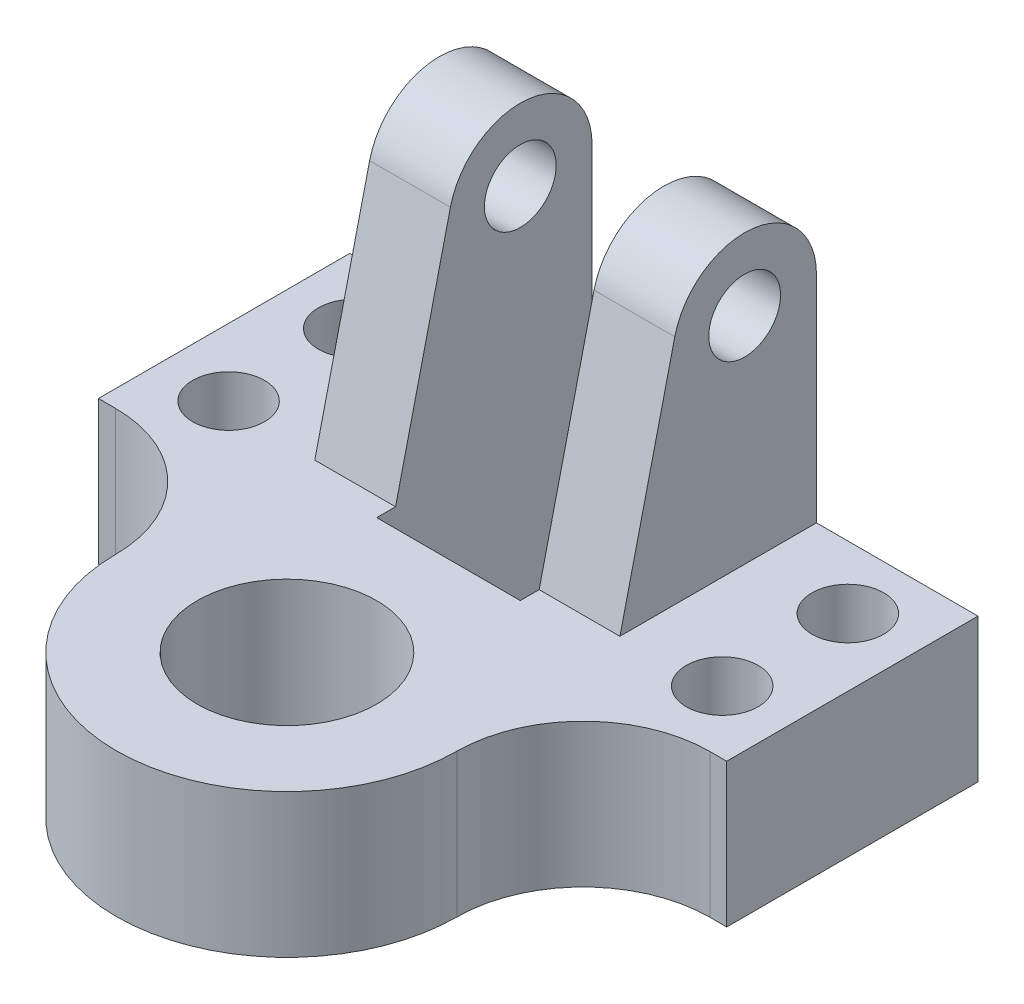
ISO-10303-21;
HEADER;
FILE_DESCRIPTION(('STEP AP214'),'2;1');
FILE_NAME('part.step','',(''),(''),'','','');
FILE_SCHEMA(('AUTOMOTIVE_DESIGN { 1 0 10303 214 1 1 1 1 }'));
ENDSEC;
DATA;
#1=APPLICATION_CONTEXT('core data for automotive mechanical design processes');
#2=APPLICATION_PROTOCOL_DEFINITION('international standard','automotive_design',2000,#1);
#3=PRODUCT_CONTEXT('',#1,'mechanical');
#4=PRODUCT('Part','Part','',(#3));
#5=PRODUCT_RELATED_PRODUCT_CATEGORY('part','',(#4));
#6=PRODUCT_DEFINITION_FORMATION('','',#4);
#7=PRODUCT_DEFINITION_CONTEXT('part definition',#1,'design');
#8=PRODUCT_DEFINITION('design','',#6,#7);
#9=PRODUCT_DEFINITION_SHAPE('','',#8);
#10=(LENGTH_UNIT() NAMED_UNIT(*) SI_UNIT(.MILLI.,.METRE.));
#11=(NAMED_UNIT(*) PLANE_ANGLE_UNIT() SI_UNIT($,.RADIAN.));
#12=(NAMED_UNIT(*) SI_UNIT($,.STERADIAN.) SOLID_ANGLE_UNIT());
#13=UNCERTAINTY_MEASURE_WITH_UNIT(LENGTH_MEASURE(1.E-05),#10,'distance_accuracy_value','');
#14=(GEOMETRIC_REPRESENTATION_CONTEXT(3) GLOBAL_UNCERTAINTY_ASSIGNED_CONTEXT((#13)) GLOBAL_UNIT_ASSIGNED_CONTEXT((#10,
#11,#12)) REPRESENTATION_CONTEXT('',''));
#15=CARTESIAN_POINT('',(0.,0.,0.));
#16=DIRECTION('',(0.,0.,1.));
#17=DIRECTION('',(1.,0.,0.));
#18=AXIS2_PLACEMENT_3D('',#15,#16,#17);
#19=CARTESIAN_POINT('',(0.,812.8,0.));
#20=DIRECTION('',(0.,1.,0.));
#21=DIRECTION('',(0.,0.,1.));
#22=AXIS2_PLACEMENT_3D('',#19,#20,#21);
#23=PLANE('',#22);
#24=DIRECTION('',(1.,0.,0.));
#25=VECTOR('',#24,1.);
#26=CARTESIAN_POINT('',(-476.677634847667,812.8,1112.385962125));
#27=LINE('',#26,#25);
#28=CARTESIAN_POINT('',(-476.677634847667,812.8,1112.385962125));
#29=VERTEX_POINT('',#28);
#30=CARTESIAN_POINT('',(-19.4776348476665,812.8,1112.385962125));
#31=VERTEX_POINT('',#30);
#32=EDGE_CURVE('E209',#29,#31,#27,.T.);
#33=ORIENTED_EDGE('',*,*,#32,.F.);
#34=DIRECTION('',(0.,0.,1.));
#35=VECTOR('',#34,1.);
#36=CARTESIAN_POINT('',(-476.677634847667,812.8,-8.6754024829885E-13));
#37=LINE('',#36,#35);
#38=CARTESIAN_POINT('',(-476.677634847667,812.8,0.));
#39=VERTEX_POINT('',#38);
#40=EDGE_CURVE('E70',#39,#29,#37,.T.);
#41=ORIENTED_EDGE('',*,*,#40,.F.);
#42=DIRECTION('',(1.,0.,0.));
#43=VECTOR('',#42,1.);
#44=CARTESIAN_POINT('',(0.,812.8,0.));
#45=LINE('',#44,#43);
#46=CARTESIAN_POINT('',(-1391.07763484767,812.8,0.));
#47=VERTEX_POINT('',#46);
#48=EDGE_CURVE('E194',#47,#39,#45,.T.);
#49=ORIENTED_EDGE('',*,*,#48,.F.);
#50=DIRECTION('',(0.,0.,-1.));
#51=VECTOR('',#50,1.);
#52=CARTESIAN_POINT('',(-1391.07763484767,812.8,0.));
#53=LINE('',#52,#51);
#54=CARTESIAN_POINT('',(-1391.07763484767,812.8,1422.4));
#55=VERTEX_POINT('',#54);
#56=EDGE_CURVE('E304',#55,#47,#53,.T.);
#57=ORIENTED_EDGE('',*,*,#56,.F.);
#58=DIRECTION('',(1.,0.,0.));
#59=VECTOR('',#58,1.);
#60=CARTESIAN_POINT('',(0.,812.8,1422.4));
#61=LINE('',#60,#59);
#62=CARTESIAN_POINT('',(-1295.81565367294,812.8,1422.4));
#63=VERTEX_POINT('',#62);
#64=EDGE_CURVE('E310',#55,#63,#61,.T.);
#65=ORIENTED_EDGE('',*,*,#64,.T.);
#66=CARTESIAN_POINT('',(-1295.81565367294,812.8,2139.95));
#67=DIRECTION('',(0.,1.,0.));
#68=DIRECTION('',(0.,0.,1.));
#69=AXIS2_PLACEMENT_3D('',#66,#67,#68);
#70=CIRCLE('',#69,717.55);
#71=CARTESIAN_POINT('',(-578.270762626689,812.8,2137.24226415094));
#72=VERTEX_POINT('',#71);
#73=EDGE_CURVE('E11',#63,#72,#70,.F.);
#74=ORIENTED_EDGE('',*,*,#73,.T.);
#75=CARTESIAN_POINT('',(386.922365152335,812.8,2133.6));
#76=DIRECTION('',(0.,1.,0.));
#77=DIRECTION('',(0.,0.,1.));
#78=AXIS2_PLACEMENT_3D('',#75,#76,#77);
#79=CIRCLE('',#78,965.2);
#80=CARTESIAN_POINT('',(1352.11549293136,812.8,2137.24226415094));
#81=VERTEX_POINT('',#80);
#82=EDGE_CURVE('E282',#72,#81,#79,.T.);
#83=ORIENTED_EDGE('',*,*,#82,.T.);
#84=CARTESIAN_POINT('',(2069.66038397761,812.8,2139.95));
#85=DIRECTION('',(0.,1.,0.));
#86=DIRECTION('',(0.,0.,1.));
#87=AXIS2_PLACEMENT_3D('',#84,#85,#86);
#88=CIRCLE('',#87,717.55);
#89=CARTESIAN_POINT('',(2069.66038397761,812.8,1422.4));
#90=VERTEX_POINT('',#89);
#91=EDGE_CURVE('E415',#81,#90,#88,.F.);
#92=ORIENTED_EDGE('',*,*,#91,.T.);
#93=DIRECTION('',(1.,0.,0.));
#94=VECTOR('',#93,1.);
#95=CARTESIAN_POINT('',(0.,812.8,1422.4));
#96=LINE('',#95,#94);
#97=CARTESIAN_POINT('',(2164.92236515233,812.8,1422.4));
#98=VERTEX_POINT('',#97);
#99=EDGE_CURVE('E283',#90,#98,#96,.T.);
#100=ORIENTED_EDGE('',*,*,#99,.T.);
#101=DIRECTION('',(0.,0.,-1.));
#102=VECTOR('',#101,1.);
#103=CARTESIAN_POINT('',(2164.92236515233,812.8,0.));
#104=LINE('',#103,#102);
#105=CARTESIAN_POINT('',(2164.92236515233,812.8,0.));
#106=VERTEX_POINT('',#105);
#107=EDGE_CURVE('E286',#98,#106,#104,.T.);
#108=ORIENTED_EDGE('',*,*,#107,.T.);
#109=DIRECTION('',(-1.,0.,0.));
#110=VECTOR('',#109,1.);
#111=CARTESIAN_POINT('',(0.,812.8,0.));
#112=LINE('',#111,#110);
#113=CARTESIAN_POINT('',(1250.52236515233,812.8,9.14165321818997E-13));
#114=VERTEX_POINT('',#113);
#115=EDGE_CURVE('E292',#106,#114,#112,.T.);
#116=ORIENTED_EDGE('',*,*,#115,.T.);
#117=DIRECTION('',(0.,0.,1.));
#118=VECTOR('',#117,1.);
#119=CARTESIAN_POINT('',(1250.52236515233,812.8,9.14165321818997E-13));
#120=LINE('',#119,#118);
#121=CARTESIAN_POINT('',(1250.52236515233,812.8,1112.385962125));
#122=VERTEX_POINT('',#121);
#123=EDGE_CURVE('E223',#114,#122,#120,.T.);
#124=ORIENTED_EDGE('',*,*,#123,.T.);
#125=DIRECTION('',(-1.,0.,0.));
#126=VECTOR('',#125,1.);
#127=CARTESIAN_POINT('',(1250.52236515233,812.8,1112.385962125));
#128=LINE('',#127,#126);
#129=CARTESIAN_POINT('',(793.322365152332,812.8,1112.385962125));
#130=VERTEX_POINT('',#129);
#131=EDGE_CURVE('E244',#122,#130,#128,.T.);
#132=ORIENTED_EDGE('',*,*,#131,.T.);
#133=DIRECTION('',(0.,0.,1.));
#134=VECTOR('',#133,1.);
#135=CARTESIAN_POINT('',(793.322365152334,812.8,1.73378888925631E-12));
#136=LINE('',#135,#134);
#137=CARTESIAN_POINT('',(793.322365152332,812.8,1219.2));
#138=VERTEX_POINT('',#137);
#139=EDGE_CURVE('E293',#130,#138,#136,.T.);
#140=ORIENTED_EDGE('',*,*,#139,.T.);
#141=DIRECTION('',(-1.,0.,0.));
#142=VECTOR('',#141,1.);
#143=CARTESIAN_POINT('',(0.,812.8,1219.2));
#144=LINE('',#143,#142);
#145=CARTESIAN_POINT('',(-19.4776348476664,812.8,1219.2));
#146=VERTEX_POINT('',#145);
#147=EDGE_CURVE('E300',#138,#146,#144,.T.);
#148=ORIENTED_EDGE('',*,*,#147,.T.);
#149=DIRECTION('',(0.,0.,1.));
#150=VECTOR('',#149,1.);
#151=CARTESIAN_POINT('',(-19.4776348476666,812.8,0.));
#152=LINE('',#151,#150);
#153=EDGE_CURVE('E62',#31,#146,#152,.T.);
#154=ORIENTED_EDGE('',*,*,#153,.F.);
#155=EDGE_LOOP('',(#33,#41,#49,#57,#65,#74,#83,#92,#100,#108,#116,#124,#132,#140,#148,#154));
#156=FACE_BOUND('',#155,.T.);
#157=CARTESIAN_POINT('',(386.922365152335,812.8,2133.6));
#158=DIRECTION('',(0.,1.,0.));
#159=DIRECTION('',(0.,0.,1.));
#160=AXIS2_PLACEMENT_3D('',#157,#158,#159);
#161=CIRCLE('',#160,508.);
#162=CARTESIAN_POINT('',(386.922365152335,812.8,2641.6));
#163=VERTEX_POINT('',#162);
#164=EDGE_CURVE('E257',#163,#163,#161,.T.);
#165=ORIENTED_EDGE('',*,*,#164,.F.);
#166=EDGE_LOOP('',(#165));
#167=FACE_BOUND('',#166,.T.);
#168=CARTESIAN_POINT('',(1783.92236515233,812.8,1066.8));
#169=DIRECTION('',(0.,1.,0.));
#170=DIRECTION('',(0.,0.,1.));
#171=AXIS2_PLACEMENT_3D('',#168,#169,#170);
#172=CIRCLE('',#171,203.200000000001);
#173=CARTESIAN_POINT('',(1783.92236515233,812.8,1270.));
#174=VERTEX_POINT('',#173);
#175=EDGE_CURVE('E262',#174,#174,#172,.T.);
#176=ORIENTED_EDGE('',*,*,#175,.F.);
#177=EDGE_LOOP('',(#176));
#178=FACE_BOUND('',#177,.T.);
#179=CARTESIAN_POINT('',(1783.92236515233,812.8,355.6));
#180=DIRECTION('',(0.,1.,0.));
#181=DIRECTION('',(0.,0.,1.));
#182=AXIS2_PLACEMENT_3D('',#179,#180,#181);
#183=CIRCLE('',#182,203.200000000001);
#184=CARTESIAN_POINT('',(1783.92236515233,812.8,558.800000000001));
#185=VERTEX_POINT('',#184);
#186=EDGE_CURVE('E267',#185,#185,#183,.T.);
#187=ORIENTED_EDGE('',*,*,#186,.F.);
#188=EDGE_LOOP('',(#187));
#189=FACE_BOUND('',#188,.T.);
#190=CARTESIAN_POINT('',(-1010.07763484767,812.8,1066.8));
#191=DIRECTION('',(0.,1.,0.));
#192=DIRECTION('',(0.,0.,1.));
#193=AXIS2_PLACEMENT_3D('',#190,#191,#192);
#194=CIRCLE('',#193,203.2);
#195=CARTESIAN_POINT('',(-1010.07763484767,812.8,1270.));
#196=VERTEX_POINT('',#195);
#197=EDGE_CURVE('E272',#196,#196,#194,.T.);
#198=ORIENTED_EDGE('',*,*,#197,.F.);
#199=EDGE_LOOP('',(#198));
#200=FACE_BOUND('',#199,.T.);
#201=CARTESIAN_POINT('',(-1010.07763484767,812.8,355.6));
#202=DIRECTION('',(0.,1.,0.));
#203=DIRECTION('',(0.,0.,1.));
#204=AXIS2_PLACEMENT_3D('',#201,#202,#203);
#205=CIRCLE('',#204,203.2);
#206=CARTESIAN_POINT('',(-1010.07763484767,812.8,558.8));
#207=VERTEX_POINT('',#206);
#208=EDGE_CURVE('E280',#207,#207,#205,.T.);
#209=ORIENTED_EDGE('',*,*,#208,.F.);
#210=EDGE_LOOP('',(#209));
#211=FACE_BOUND('',#210,.T.);
#212=ADVANCED_FACE('F44',(#156,#167,#178,#189,#200,#211),#23,.T.);
#213=CARTESIAN_POINT('',(386.922365152335,812.8,2133.6));
#214=DIRECTION('',(0.,-1.,0.));
#215=DIRECTION('',(0.,0.,-1.));
#216=AXIS2_PLACEMENT_3D('',#213,#214,#215);
#217=CYLINDRICAL_SURFACE('',#216,965.2);
#218=CARTESIAN_POINT('',(386.922365152335,0.,2133.6));
#219=DIRECTION('',(0.,1.,0.));
#220=DIRECTION('',(0.,0.,1.));
#221=AXIS2_PLACEMENT_3D('',#218,#219,#220);
#222=CIRCLE('',#221,965.2);
#223=CARTESIAN_POINT('',(-578.270762626689,0.,2137.24226415094));
#224=VERTEX_POINT('',#223);
#225=CARTESIAN_POINT('',(1352.11549293136,0.,2137.24226415094));
#226=VERTEX_POINT('',#225);
#227=EDGE_CURVE('E334',#224,#226,#222,.T.);
#228=ORIENTED_EDGE('',*,*,#227,.T.);
#229=DIRECTION('',(0.,-1.,0.));
#230=VECTOR('',#229,1.);
#231=CARTESIAN_POINT('',(1352.11549293136,812.8,2137.24226415094));
#232=LINE('',#231,#230);
#233=EDGE_CURVE('E401',#226,#81,#232,.F.);
#234=ORIENTED_EDGE('',*,*,#233,.T.);
#235=ORIENTED_EDGE('',*,*,#82,.F.);
#236=DIRECTION('',(0.,-1.,0.));
#237=VECTOR('',#236,1.);
#238=CARTESIAN_POINT('',(-578.270762626689,812.8,2137.24226415094));
#239=LINE('',#238,#237);
#240=EDGE_CURVE('E397',#72,#224,#239,.T.);
#241=ORIENTED_EDGE('',*,*,#240,.T.);
#242=EDGE_LOOP('',(#228,#234,#235,#241));
#243=FACE_BOUND('',#242,.T.);
#244=ADVANCED_FACE('F435',(#243),#217,.T.);
#245=CARTESIAN_POINT('',(0.,812.8,1422.4));
#246=DIRECTION('',(0.,0.,-1.));
#247=DIRECTION('',(-1.,0.,0.));
#248=AXIS2_PLACEMENT_3D('',#245,#246,#247);
#249=PLANE('',#248);
#250=ORIENTED_EDGE('',*,*,#99,.F.);
#251=DIRECTION('',(0.,1.,0.));
#252=VECTOR('',#251,1.);
#253=CARTESIAN_POINT('',(2069.66038397761,0.,1422.4));
#254=LINE('',#253,#252);
#255=CARTESIAN_POINT('',(2069.66038397761,0.,1422.4));
#256=VERTEX_POINT('',#255);
#257=EDGE_CURVE('E393',#90,#256,#254,.F.);
#258=ORIENTED_EDGE('',*,*,#257,.T.);
#259=DIRECTION('',(1.,0.,0.));
#260=VECTOR('',#259,1.);
#261=CARTESIAN_POINT('',(0.,0.,1422.4));
#262=LINE('',#261,#260);
#263=CARTESIAN_POINT('',(2164.92236515233,0.,1422.4));
#264=VERTEX_POINT('',#263);
#265=EDGE_CURVE('E339',#256,#264,#262,.T.);
#266=ORIENTED_EDGE('',*,*,#265,.T.);
#267=DIRECTION('',(0.,-1.,0.));
#268=VECTOR('',#267,1.);
#269=CARTESIAN_POINT('',(2164.92236515233,812.8,1422.4));
#270=LINE('',#269,#268);
#271=EDGE_CURVE('E392',#98,#264,#270,.T.);
#272=ORIENTED_EDGE('',*,*,#271,.F.);
#273=EDGE_LOOP('',(#250,#258,#266,#272));
#274=FACE_BOUND('',#273,.T.);
#275=ADVANCED_FACE('F439',(#274),#249,.F.);
#276=CARTESIAN_POINT('',(2164.92236515233,812.8,0.));
#277=DIRECTION('',(-1.,0.,0.));
#278=DIRECTION('',(0.,0.,1.));
#279=AXIS2_PLACEMENT_3D('',#276,#277,#278);
#280=PLANE('',#279);
#281=DIRECTION('',(0.,0.,-1.));
#282=VECTOR('',#281,1.);
#283=CARTESIAN_POINT('',(2164.92236515233,0.,0.));
#284=LINE('',#283,#282);
#285=CARTESIAN_POINT('',(2164.92236515233,0.,0.));
#286=VERTEX_POINT('',#285);
#287=EDGE_CURVE('E338',#264,#286,#284,.T.);
#288=ORIENTED_EDGE('',*,*,#287,.T.);
#289=DIRECTION('',(0.,-1.,0.));
#290=VECTOR('',#289,1.);
#291=CARTESIAN_POINT('',(2164.92236515233,812.8,0.));
#292=LINE('',#291,#290);
#293=EDGE_CURVE('E390',#106,#286,#292,.T.);
#294=ORIENTED_EDGE('',*,*,#293,.F.);
#295=ORIENTED_EDGE('',*,*,#107,.F.);
#296=ORIENTED_EDGE('',*,*,#271,.T.);
#297=EDGE_LOOP('',(#288,#294,#295,#296));
#298=FACE_BOUND('',#297,.T.);
#299=ADVANCED_FACE('F447',(#298),#280,.F.);
#300=CARTESIAN_POINT('',(0.,812.8,0.));
#301=DIRECTION('',(0.,0.,1.));
#302=DIRECTION('',(1.,0.,0.));
#303=AXIS2_PLACEMENT_3D('',#300,#301,#302);
#304=PLANE('',#303);
#305=DIRECTION('',(-1.,0.,0.));
#306=VECTOR('',#305,1.);
#307=CARTESIAN_POINT('',(0.,0.,0.));
#308=LINE('',#307,#306);
#309=CARTESIAN_POINT('',(793.322365152334,0.,0.));
#310=VERTEX_POINT('',#309);
#311=EDGE_CURVE('E341',#286,#310,#308,.T.);
#312=ORIENTED_EDGE('',*,*,#311,.T.);
#313=DIRECTION('',(0.,-1.,0.));
#314=VECTOR('',#313,1.);
#315=CARTESIAN_POINT('',(793.322365152334,812.8,0.));
#316=LINE('',#315,#314);
#317=CARTESIAN_POINT('',(793.322365152334,2032.,0.));
#318=VERTEX_POINT('',#317);
#319=EDGE_CURVE('E382',#318,#310,#316,.T.);
#320=ORIENTED_EDGE('',*,*,#319,.F.);
#321=DIRECTION('',(-1.,0.,0.));
#322=VECTOR('',#321,1.);
#323=CARTESIAN_POINT('',(1250.52236515233,2032.,9.14165321818997E-13));
#324=LINE('',#323,#322);
#325=CARTESIAN_POINT('',(1250.52236515233,2032.,9.14165321818997E-13));
#326=VERTEX_POINT('',#325);
#327=EDGE_CURVE('E247',#326,#318,#324,.T.);
#328=ORIENTED_EDGE('',*,*,#327,.F.);
#329=DIRECTION('',(0.,-1.,0.));
#330=VECTOR('',#329,1.);
#331=CARTESIAN_POINT('',(1250.52236515233,812.8,9.14165321818997E-13));
#332=LINE('',#331,#330);
#333=EDGE_CURVE('E236',#326,#114,#332,.T.);
#334=ORIENTED_EDGE('',*,*,#333,.T.);
#335=ORIENTED_EDGE('',*,*,#115,.F.);
#336=ORIENTED_EDGE('',*,*,#293,.T.);
#337=EDGE_LOOP('',(#312,#320,#328,#334,#335,#336));
#338=FACE_BOUND('',#337,.T.);
#339=ADVANCED_FACE('F446',(#338),#304,.F.);
#340=CARTESIAN_POINT('',(793.322365152334,812.8,1.73378888925631E-12));
#341=DIRECTION('',(1.,0.,0.));
#342=DIRECTION('',(0.,0.,-1.));
#343=AXIS2_PLACEMENT_3D('',#340,#341,#342);
#344=PLANE('',#343);
#345=DIRECTION('',(0.,0.,1.));
#346=VECTOR('',#345,1.);
#347=CARTESIAN_POINT('',(793.322365152334,0.,1.73378888925631E-12));
#348=LINE('',#347,#346);
#349=CARTESIAN_POINT('',(793.322365152332,0.,1219.2));
#350=VERTEX_POINT('',#349);
#351=EDGE_CURVE('E347',#310,#350,#348,.T.);
#352=ORIENTED_EDGE('',*,*,#351,.T.);
#353=DIRECTION('',(0.,-1.,0.));
#354=VECTOR('',#353,1.);
#355=CARTESIAN_POINT('',(793.322365152332,812.8,1219.2));
#356=LINE('',#355,#354);
#357=EDGE_CURVE('E377',#138,#350,#356,.T.);
#358=ORIENTED_EDGE('',*,*,#357,.F.);
#359=ORIENTED_EDGE('',*,*,#139,.F.);
#360=DIRECTION('',(0.,0.973149193337797,-0.230175253895796));
#361=VECTOR('',#360,1.);
#362=CARTESIAN_POINT('',(793.322365152332,812.8,1112.385962125));
#363=LINE('',#362,#361);
#364=CARTESIAN_POINT('',(793.322365152333,2125.54322318325,801.88783217248));
#365=VERTEX_POINT('',#364);
#366=EDGE_CURVE('E222',#130,#365,#363,.T.);
#367=ORIENTED_EDGE('',*,*,#366,.T.);
#368=CARTESIAN_POINT('',(793.322365152334,2032.,406.4));
#369=DIRECTION('',(-1.,0.,0.));
#370=DIRECTION('',(0.,0.,1.));
#371=AXIS2_PLACEMENT_3D('',#368,#369,#370);
#372=CIRCLE('',#371,406.399999999999);
#373=EDGE_CURVE('E228',#365,#318,#372,.T.);
#374=ORIENTED_EDGE('',*,*,#373,.T.);
#375=ORIENTED_EDGE('',*,*,#319,.T.);
#376=EDGE_LOOP('',(#352,#358,#359,#367,#374,#375));
#377=FACE_BOUND('',#376,.T.);
#378=CARTESIAN_POINT('',(793.322365152334,2032.,406.4));
#379=DIRECTION('',(-1.,0.,0.));
#380=DIRECTION('',(0.,0.,1.));
#381=AXIS2_PLACEMENT_3D('',#378,#379,#380);
#382=CIRCLE('',#381,203.2);
#383=CARTESIAN_POINT('',(793.322365152333,2032.,609.6));
#384=VERTEX_POINT('',#383);
#385=EDGE_CURVE('E212',#384,#384,#382,.T.);
#386=ORIENTED_EDGE('',*,*,#385,.F.);
#387=EDGE_LOOP('',(#386));
#388=FACE_BOUND('',#387,.T.);
#389=ADVANCED_FACE('F464',(#377,#388),#344,.F.);
#390=CARTESIAN_POINT('',(0.,812.8,1219.2));
#391=DIRECTION('',(0.,0.,1.));
#392=DIRECTION('',(1.,0.,0.));
#393=AXIS2_PLACEMENT_3D('',#390,#391,#392);
#394=PLANE('',#393);
#395=DIRECTION('',(-1.,0.,0.));
#396=VECTOR('',#395,1.);
#397=CARTESIAN_POINT('',(0.,0.,1219.2));
#398=LINE('',#397,#396);
#399=CARTESIAN_POINT('',(-19.4776348476664,0.,1219.2));
#400=VERTEX_POINT('',#399);
#401=EDGE_CURVE('E349',#350,#400,#398,.T.);
#402=ORIENTED_EDGE('',*,*,#401,.T.);
#403=DIRECTION('',(0.,-1.,0.));
#404=VECTOR('',#403,1.);
#405=CARTESIAN_POINT('',(-19.4776348476664,812.8,1219.2));
#406=LINE('',#405,#404);
#407=EDGE_CURVE('E376',#146,#400,#406,.T.);
#408=ORIENTED_EDGE('',*,*,#407,.F.);
#409=ORIENTED_EDGE('',*,*,#147,.F.);
#410=ORIENTED_EDGE('',*,*,#357,.T.);
#411=EDGE_LOOP('',(#402,#408,#409,#410));
#412=FACE_BOUND('',#411,.T.);
#413=ADVANCED_FACE('F467',(#412),#394,.F.);
#414=CARTESIAN_POINT('',(-19.4776348476666,812.8,0.));
#415=DIRECTION('',(1.,0.,0.));
#416=DIRECTION('',(0.,0.,-1.));
#417=AXIS2_PLACEMENT_3D('',#414,#415,#416);
#418=PLANE('',#417);
#419=DIRECTION('',(0.,0.,1.));
#420=VECTOR('',#419,1.);
#421=CARTESIAN_POINT('',(-19.4776348476666,0.,0.));
#422=LINE('',#421,#420);
#423=CARTESIAN_POINT('',(-19.4776348476666,0.,0.));
#424=VERTEX_POINT('',#423);
#425=EDGE_CURVE('E355',#424,#400,#422,.T.);
#426=ORIENTED_EDGE('',*,*,#425,.F.);
#427=DIRECTION('',(0.,-1.,0.));
#428=VECTOR('',#427,1.);
#429=CARTESIAN_POINT('',(-19.4776348476666,812.8,0.));
#430=LINE('',#429,#428);
#431=CARTESIAN_POINT('',(-19.4776348476666,2032.,-9.23485080399102E-13));
#432=VERTEX_POINT('',#431);
#433=EDGE_CURVE('E373',#432,#424,#430,.T.);
#434=ORIENTED_EDGE('',*,*,#433,.F.);
#435=CARTESIAN_POINT('',(-19.4776348476666,2032.,406.399999999999));
#436=DIRECTION('',(-1.,0.,0.));
#437=DIRECTION('',(0.,0.,1.));
#438=AXIS2_PLACEMENT_3D('',#435,#436,#437);
#439=CIRCLE('',#438,406.399999999999);
#440=CARTESIAN_POINT('',(-19.4776348476665,2125.54322318325,801.887832172479));
#441=VERTEX_POINT('',#440);
#442=EDGE_CURVE('E190',#441,#432,#439,.T.);
#443=ORIENTED_EDGE('',*,*,#442,.F.);
#444=DIRECTION('',(0.,0.973149193337797,-0.230175253895796));
#445=VECTOR('',#444,1.);
#446=CARTESIAN_POINT('',(-19.4776348476665,812.8,1112.385962125));
#447=LINE('',#446,#445);
#448=EDGE_CURVE('E200',#31,#441,#447,.T.);
#449=ORIENTED_EDGE('',*,*,#448,.F.);
#450=ORIENTED_EDGE('',*,*,#153,.T.);
#451=ORIENTED_EDGE('',*,*,#407,.T.);
#452=EDGE_LOOP('',(#426,#434,#443,#449,#450,#451));
#453=FACE_BOUND('',#452,.T.);
#454=CARTESIAN_POINT('',(-19.4776348476666,2032.,406.399999999999));
#455=DIRECTION('',(-1.,0.,0.));
#456=DIRECTION('',(0.,0.,1.));
#457=AXIS2_PLACEMENT_3D('',#454,#455,#456);
#458=CIRCLE('',#457,203.2);
#459=CARTESIAN_POINT('',(-19.4776348476666,2032.,609.599999999999));
#460=VERTEX_POINT('',#459);
#461=EDGE_CURVE('E726',#460,#460,#458,.T.);
#462=ORIENTED_EDGE('',*,*,#461,.T.);
#463=EDGE_LOOP('',(#462));
#464=FACE_BOUND('',#463,.T.);
#465=ADVANCED_FACE('F472',(#453,#464),#418,.T.);
#466=CARTESIAN_POINT('',(0.,812.8,0.));
#467=DIRECTION('',(0.,0.,-1.));
#468=DIRECTION('',(-1.,0.,0.));
#469=AXIS2_PLACEMENT_3D('',#466,#467,#468);
#470=PLANE('',#469);
#471=DIRECTION('',(1.,0.,0.));
#472=VECTOR('',#471,1.);
#473=CARTESIAN_POINT('',(0.,0.,0.));
#474=LINE('',#473,#472);
#475=CARTESIAN_POINT('',(-1391.07763484767,0.,0.));
#476=VERTEX_POINT('',#475);
#477=EDGE_CURVE('E360',#476,#424,#474,.T.);
#478=ORIENTED_EDGE('',*,*,#477,.F.);
#479=DIRECTION('',(0.,-1.,0.));
#480=VECTOR('',#479,1.);
#481=CARTESIAN_POINT('',(-1391.07763484767,812.8,0.));
#482=LINE('',#481,#480);
#483=EDGE_CURVE('E367',#47,#476,#482,.T.);
#484=ORIENTED_EDGE('',*,*,#483,.F.);
#485=ORIENTED_EDGE('',*,*,#48,.T.);
#486=DIRECTION('',(0.,-1.,0.));
#487=VECTOR('',#486,1.);
#488=CARTESIAN_POINT('',(-476.677634847667,812.8,-8.6754024829885E-13));
#489=LINE('',#488,#487);
#490=CARTESIAN_POINT('',(-476.677634847667,2032.,-8.6754024829885E-13));
#491=VERTEX_POINT('',#490);
#492=EDGE_CURVE('E173',#491,#39,#489,.T.);
#493=ORIENTED_EDGE('',*,*,#492,.F.);
#494=DIRECTION('',(1.,0.,0.));
#495=VECTOR('',#494,1.);
#496=CARTESIAN_POINT('',(-476.677634847667,2032.,-8.6754024829885E-13));
#497=LINE('',#496,#495);
#498=EDGE_CURVE('E183',#491,#432,#497,.T.);
#499=ORIENTED_EDGE('',*,*,#498,.T.);
#500=ORIENTED_EDGE('',*,*,#433,.T.);
#501=EDGE_LOOP('',(#478,#484,#485,#493,#499,#500));
#502=FACE_BOUND('',#501,.T.);
#503=ADVANCED_FACE('F192',(#502),#470,.T.);
#504=CARTESIAN_POINT('',(-1391.07763484767,812.8,0.));
#505=DIRECTION('',(-1.,0.,0.));
#506=DIRECTION('',(0.,0.,1.));
#507=AXIS2_PLACEMENT_3D('',#504,#505,#506);
#508=PLANE('',#507);
#509=DIRECTION('',(0.,0.,-1.));
#510=VECTOR('',#509,1.);
#511=CARTESIAN_POINT('',(-1391.07763484767,0.,0.));
#512=LINE('',#511,#510);
#513=CARTESIAN_POINT('',(-1391.07763484767,0.,1422.4));
#514=VERTEX_POINT('',#513);
#515=EDGE_CURVE('E363',#514,#476,#512,.T.);
#516=ORIENTED_EDGE('',*,*,#515,.F.);
#517=DIRECTION('',(0.,-1.,0.));
#518=VECTOR('',#517,1.);
#519=CARTESIAN_POINT('',(-1391.07763484767,812.8,1422.4));
#520=LINE('',#519,#518);
#521=EDGE_CURVE('E311',#55,#514,#520,.T.);
#522=ORIENTED_EDGE('',*,*,#521,.F.);
#523=ORIENTED_EDGE('',*,*,#56,.T.);
#524=ORIENTED_EDGE('',*,*,#483,.T.);
#525=EDGE_LOOP('',(#516,#522,#523,#524));
#526=FACE_BOUND('',#525,.T.);
#527=ADVANCED_FACE('F505',(#526),#508,.T.);
#528=CARTESIAN_POINT('',(-1010.07763484767,812.8,355.6));
#529=DIRECTION('',(0.,-1.,0.));
#530=DIRECTION('',(0.,0.,-1.));
#531=AXIS2_PLACEMENT_3D('',#528,#529,#530);
#532=CYLINDRICAL_SURFACE('',#531,203.2);
#533=ORIENTED_EDGE('',*,*,#208,.T.);
#534=EDGE_LOOP('',(#533));
#535=FACE_BOUND('',#534,.T.);
#536=CARTESIAN_POINT('',(-1010.07763484767,0.,355.6));
#537=DIRECTION('',(0.,1.,0.));
#538=DIRECTION('',(0.,0.,1.));
#539=AXIS2_PLACEMENT_3D('',#536,#537,#538);
#540=CIRCLE('',#539,203.2);
#541=CARTESIAN_POINT('',(-1010.07763484767,0.,558.8));
#542=VERTEX_POINT('',#541);
#543=EDGE_CURVE('E328',#542,#542,#540,.T.);
#544=ORIENTED_EDGE('',*,*,#543,.F.);
#545=EDGE_LOOP('',(#544));
#546=FACE_BOUND('',#545,.T.);
#547=ADVANCED_FACE('F508',(#535,#546),#532,.F.);
#548=CARTESIAN_POINT('',(-1010.07763484767,812.8,1066.8));
#549=DIRECTION('',(0.,-1.,0.));
#550=DIRECTION('',(0.,0.,-1.));
#551=AXIS2_PLACEMENT_3D('',#548,#549,#550);
#552=CYLINDRICAL_SURFACE('',#551,203.2);
#553=ORIENTED_EDGE('',*,*,#197,.T.);
#554=EDGE_LOOP('',(#553));
#555=FACE_BOUND('',#554,.T.);
#556=CARTESIAN_POINT('',(-1010.07763484767,0.,1066.8));
#557=DIRECTION('',(0.,1.,0.));
#558=DIRECTION('',(0.,0.,1.));
#559=AXIS2_PLACEMENT_3D('',#556,#557,#558);
#560=CIRCLE('',#559,203.2);
#561=CARTESIAN_POINT('',(-1010.07763484767,0.,1270.));
#562=VERTEX_POINT('',#561);
#563=EDGE_CURVE('E324',#562,#562,#560,.T.);
#564=ORIENTED_EDGE('',*,*,#563,.F.);
#565=EDGE_LOOP('',(#564));
#566=FACE_BOUND('',#565,.T.);
#567=ADVANCED_FACE('F521',(#555,#566),#552,.F.);
#568=CARTESIAN_POINT('',(1783.92236515233,812.8,355.6));
#569=DIRECTION('',(0.,-1.,0.));
#570=DIRECTION('',(0.,0.,-1.));
#571=AXIS2_PLACEMENT_3D('',#568,#569,#570);
#572=CYLINDRICAL_SURFACE('',#571,203.200000000001);
#573=ORIENTED_EDGE('',*,*,#186,.T.);
#574=EDGE_LOOP('',(#573));
#575=FACE_BOUND('',#574,.T.);
#576=CARTESIAN_POINT('',(1783.92236515233,0.,355.6));
#577=DIRECTION('',(0.,1.,0.));
#578=DIRECTION('',(0.,0.,1.));
#579=AXIS2_PLACEMENT_3D('',#576,#577,#578);
#580=CIRCLE('',#579,203.200000000001);
#581=CARTESIAN_POINT('',(1783.92236515233,0.,558.800000000001));
#582=VERTEX_POINT('',#581);
#583=EDGE_CURVE('E321',#582,#582,#580,.T.);
#584=ORIENTED_EDGE('',*,*,#583,.F.);
#585=EDGE_LOOP('',(#584));
#586=FACE_BOUND('',#585,.T.);
#587=ADVANCED_FACE('F527',(#575,#586),#572,.F.);
#588=CARTESIAN_POINT('',(1783.92236515233,812.8,1066.8));
#589=DIRECTION('',(0.,-1.,0.));
#590=DIRECTION('',(0.,0.,-1.));
#591=AXIS2_PLACEMENT_3D('',#588,#589,#590);
#592=CYLINDRICAL_SURFACE('',#591,203.200000000001);
#593=ORIENTED_EDGE('',*,*,#175,.T.);
#594=EDGE_LOOP('',(#593));
#595=FACE_BOUND('',#594,.T.);
#596=CARTESIAN_POINT('',(1783.92236515233,0.,1066.8));
#597=DIRECTION('',(0.,1.,0.));
#598=DIRECTION('',(0.,0.,1.));
#599=AXIS2_PLACEMENT_3D('',#596,#597,#598);
#600=CIRCLE('',#599,203.200000000001);
#601=CARTESIAN_POINT('',(1783.92236515233,0.,1270.));
#602=VERTEX_POINT('',#601);
#603=EDGE_CURVE('E320',#602,#602,#600,.T.);
#604=ORIENTED_EDGE('',*,*,#603,.F.);
#605=EDGE_LOOP('',(#604));
#606=FACE_BOUND('',#605,.T.);
#607=ADVANCED_FACE('F533',(#595,#606),#592,.F.);
#608=CARTESIAN_POINT('',(386.922365152335,812.8,2133.6));
#609=DIRECTION('',(0.,-1.,0.));
#610=DIRECTION('',(0.,0.,-1.));
#611=AXIS2_PLACEMENT_3D('',#608,#609,#610);
#612=CYLINDRICAL_SURFACE('',#611,508.);
#613=ORIENTED_EDGE('',*,*,#164,.T.);
#614=EDGE_LOOP('',(#613));
#615=FACE_BOUND('',#614,.T.);
#616=CARTESIAN_POINT('',(386.922365152335,0.,2133.6));
#617=DIRECTION('',(0.,1.,0.));
#618=DIRECTION('',(0.,0.,1.));
#619=AXIS2_PLACEMENT_3D('',#616,#617,#618);
#620=CIRCLE('',#619,508.);
#621=CARTESIAN_POINT('',(386.922365152335,0.,2641.6));
#622=VERTEX_POINT('',#621);
#623=EDGE_CURVE('E251',#622,#622,#620,.T.);
#624=ORIENTED_EDGE('',*,*,#623,.F.);
#625=EDGE_LOOP('',(#624));
#626=FACE_BOUND('',#625,.T.);
#627=ADVANCED_FACE('F504',(#615,#626),#612,.F.);
#628=CARTESIAN_POINT('',(0.,812.8,1422.4));
#629=DIRECTION('',(0.,0.,-1.));
#630=DIRECTION('',(-1.,0.,0.));
#631=AXIS2_PLACEMENT_3D('',#628,#629,#630);
#632=PLANE('',#631);
#633=DIRECTION('',(1.,0.,0.));
#634=VECTOR('',#633,1.);
#635=CARTESIAN_POINT('',(0.,0.,1422.4));
#636=LINE('',#635,#634);
#637=CARTESIAN_POINT('',(-1295.81565367294,0.,1422.4));
#638=VERTEX_POINT('',#637);
#639=EDGE_CURVE('E264',#514,#638,#636,.T.);
#640=ORIENTED_EDGE('',*,*,#639,.T.);
#641=DIRECTION('',(0.,1.,0.));
#642=VECTOR('',#641,1.);
#643=CARTESIAN_POINT('',(-1295.81565367294,812.8,1422.4));
#644=LINE('',#643,#642);
#645=EDGE_CURVE('E407',#638,#63,#644,.T.);
#646=ORIENTED_EDGE('',*,*,#645,.T.);
#647=ORIENTED_EDGE('',*,*,#64,.F.);
#648=ORIENTED_EDGE('',*,*,#521,.T.);
#649=EDGE_LOOP('',(#640,#646,#647,#648));
#650=FACE_BOUND('',#649,.T.);
#651=ADVANCED_FACE('F424',(#650),#632,.F.);
#652=CARTESIAN_POINT('',(0.,0.,0.));
#653=DIRECTION('',(0.,1.,0.));
#654=DIRECTION('',(0.,0.,1.));
#655=AXIS2_PLACEMENT_3D('',#652,#653,#654);
#656=PLANE('',#655);
#657=ORIENTED_EDGE('',*,*,#623,.T.);
#658=EDGE_LOOP('',(#657));
#659=FACE_BOUND('',#658,.T.);
#660=ORIENTED_EDGE('',*,*,#603,.T.);
#661=EDGE_LOOP('',(#660));
#662=FACE_BOUND('',#661,.T.);
#663=ORIENTED_EDGE('',*,*,#583,.T.);
#664=EDGE_LOOP('',(#663));
#665=FACE_BOUND('',#664,.T.);
#666=ORIENTED_EDGE('',*,*,#563,.T.);
#667=EDGE_LOOP('',(#666));
#668=FACE_BOUND('',#667,.T.);
#669=ORIENTED_EDGE('',*,*,#543,.T.);
#670=EDGE_LOOP('',(#669));
#671=FACE_BOUND('',#670,.T.);
#672=ORIENTED_EDGE('',*,*,#227,.F.);
#673=CARTESIAN_POINT('',(-1295.81565367294,0.,2139.95));
#674=DIRECTION('',(0.,1.,0.));
#675=DIRECTION('',(0.,0.,1.));
#676=AXIS2_PLACEMENT_3D('',#673,#674,#675);
#677=CIRCLE('',#676,717.55);
#678=EDGE_CURVE('E53',#224,#638,#677,.T.);
#679=ORIENTED_EDGE('',*,*,#678,.T.);
#680=ORIENTED_EDGE('',*,*,#639,.F.);
#681=ORIENTED_EDGE('',*,*,#515,.T.);
#682=ORIENTED_EDGE('',*,*,#477,.T.);
#683=ORIENTED_EDGE('',*,*,#425,.T.);
#684=ORIENTED_EDGE('',*,*,#401,.F.);
#685=ORIENTED_EDGE('',*,*,#351,.F.);
#686=ORIENTED_EDGE('',*,*,#311,.F.);
#687=ORIENTED_EDGE('',*,*,#287,.F.);
#688=ORIENTED_EDGE('',*,*,#265,.F.);
#689=CARTESIAN_POINT('',(2069.66038397761,0.,2139.95));
#690=DIRECTION('',(0.,1.,0.));
#691=DIRECTION('',(0.,0.,1.));
#692=AXIS2_PLACEMENT_3D('',#689,#690,#691);
#693=CIRCLE('',#692,717.55);
#694=EDGE_CURVE('E406',#256,#226,#693,.T.);
#695=ORIENTED_EDGE('',*,*,#694,.T.);
#696=EDGE_LOOP('',(#672,#679,#680,#681,#682,#683,#684,#685,#686,#687,#688,#695));
#697=FACE_BOUND('',#696,.T.);
#698=ADVANCED_FACE('F416',(#659,#662,#665,#668,#671,#697),#656,.F.);
#699=CARTESIAN_POINT('',(2069.66038397761,812.8,2139.95));
#700=DIRECTION('',(0.,-1.,0.));
#701=DIRECTION('',(0.,0.,-1.));
#702=AXIS2_PLACEMENT_3D('',#699,#700,#701);
#703=CYLINDRICAL_SURFACE('',#702,717.55);
#704=ORIENTED_EDGE('',*,*,#91,.F.);
#705=ORIENTED_EDGE('',*,*,#233,.F.);
#706=ORIENTED_EDGE('',*,*,#694,.F.);
#707=ORIENTED_EDGE('',*,*,#257,.F.);
#708=EDGE_LOOP('',(#704,#705,#706,#707));
#709=FACE_BOUND('',#708,.T.);
#710=ADVANCED_FACE('F434',(#709),#703,.F.);
#711=CARTESIAN_POINT('',(-1295.81565367294,812.8,2139.95));
#712=DIRECTION('',(0.,-1.,0.));
#713=DIRECTION('',(0.,0.,-1.));
#714=AXIS2_PLACEMENT_3D('',#711,#712,#713);
#715=CYLINDRICAL_SURFACE('',#714,717.55);
#716=ORIENTED_EDGE('',*,*,#73,.F.);
#717=ORIENTED_EDGE('',*,*,#645,.F.);
#718=ORIENTED_EDGE('',*,*,#678,.F.);
#719=ORIENTED_EDGE('',*,*,#240,.F.);
#720=EDGE_LOOP('',(#716,#717,#718,#719));
#721=FACE_BOUND('',#720,.T.);
#722=ADVANCED_FACE('F50',(#721),#715,.F.);
#723=CARTESIAN_POINT('',(1250.52236515233,2032.,406.400000000001));
#724=DIRECTION('',(-1.,0.,0.));
#725=DIRECTION('',(0.,0.,1.));
#726=AXIS2_PLACEMENT_3D('',#723,#724,#725);
#727=CYLINDRICAL_SURFACE('',#726,406.399999999999);
#728=ORIENTED_EDGE('',*,*,#373,.F.);
#729=DIRECTION('',(-1.,0.,0.));
#730=VECTOR('',#729,1.);
#731=CARTESIAN_POINT('',(1250.52236515233,2125.54322318325,801.887832172481));
#732=LINE('',#731,#730);
#733=CARTESIAN_POINT('',(1250.52236515233,2125.54322318325,801.887832172481));
#734=VERTEX_POINT('',#733);
#735=EDGE_CURVE('E255',#734,#365,#732,.T.);
#736=ORIENTED_EDGE('',*,*,#735,.F.);
#737=CARTESIAN_POINT('',(1250.52236515233,2032.,406.400000000001));
#738=DIRECTION('',(-1.,0.,0.));
#739=DIRECTION('',(0.,0.,1.));
#740=AXIS2_PLACEMENT_3D('',#737,#738,#739);
#741=CIRCLE('',#740,406.399999999999);
#742=EDGE_CURVE('E232',#734,#326,#741,.T.);
#743=ORIENTED_EDGE('',*,*,#742,.T.);
#744=ORIENTED_EDGE('',*,*,#327,.T.);
#745=EDGE_LOOP('',(#728,#736,#743,#744));
#746=FACE_BOUND('',#745,.T.);
#747=ADVANCED_FACE('F545',(#746),#727,.T.);
#748=CARTESIAN_POINT('',(1250.52236515233,812.8,1112.385962125));
#749=DIRECTION('',(0.,0.230175253895796,0.973149193337797));
#750=DIRECTION('',(0.,-0.973149193337797,0.230175253895796));
#751=AXIS2_PLACEMENT_3D('',#748,#749,#750);
#752=PLANE('',#751);
#753=ORIENTED_EDGE('',*,*,#366,.F.);
#754=ORIENTED_EDGE('',*,*,#131,.F.);
#755=DIRECTION('',(0.,0.973149193337797,-0.230175253895796));
#756=VECTOR('',#755,1.);
#757=CARTESIAN_POINT('',(1250.52236515233,812.8,1112.385962125));
#758=LINE('',#757,#756);
#759=EDGE_CURVE('E226',#122,#734,#758,.T.);
#760=ORIENTED_EDGE('',*,*,#759,.T.);
#761=ORIENTED_EDGE('',*,*,#735,.T.);
#762=EDGE_LOOP('',(#753,#754,#760,#761));
#763=FACE_BOUND('',#762,.T.);
#764=ADVANCED_FACE('F460',(#763),#752,.T.);
#765=CARTESIAN_POINT('',(1250.52236515233,2032.,406.400000000001));
#766=DIRECTION('',(-1.,0.,0.));
#767=DIRECTION('',(0.,0.,1.));
#768=AXIS2_PLACEMENT_3D('',#765,#766,#767);
#769=PLANE('',#768);
#770=CARTESIAN_POINT('',(1250.52236515233,2032.,406.400000000001));
#771=DIRECTION('',(-1.,0.,0.));
#772=DIRECTION('',(0.,0.,1.));
#773=AXIS2_PLACEMENT_3D('',#770,#771,#772);
#774=CIRCLE('',#773,203.2);
#775=CARTESIAN_POINT('',(1250.52236515233,2032.,609.600000000001));
#776=VERTEX_POINT('',#775);
#777=EDGE_CURVE('E220',#776,#776,#774,.T.);
#778=ORIENTED_EDGE('',*,*,#777,.T.);
#779=EDGE_LOOP('',(#778));
#780=FACE_BOUND('',#779,.T.);
#781=ORIENTED_EDGE('',*,*,#123,.F.);
#782=ORIENTED_EDGE('',*,*,#333,.F.);
#783=ORIENTED_EDGE('',*,*,#742,.F.);
#784=ORIENTED_EDGE('',*,*,#759,.F.);
#785=EDGE_LOOP('',(#781,#782,#783,#784));
#786=FACE_BOUND('',#785,.T.);
#787=ADVANCED_FACE('F452',(#780,#786),#769,.F.);
#788=CARTESIAN_POINT('',(1250.52236515233,2032.,406.400000000001));
#789=DIRECTION('',(-1.,0.,0.));
#790=DIRECTION('',(0.,0.,1.));
#791=AXIS2_PLACEMENT_3D('',#788,#789,#790);
#792=CYLINDRICAL_SURFACE('',#791,203.2);
#793=ORIENTED_EDGE('',*,*,#777,.F.);
#794=EDGE_LOOP('',(#793));
#795=FACE_BOUND('',#794,.T.);
#796=ORIENTED_EDGE('',*,*,#385,.T.);
#797=EDGE_LOOP('',(#796));
#798=FACE_BOUND('',#797,.T.);
#799=ADVANCED_FACE('F482',(#795,#798),#792,.F.);
#800=CARTESIAN_POINT('',(-476.677634847667,2032.,406.399999999999));
#801=DIRECTION('',(1.,0.,0.));
#802=DIRECTION('',(0.,0.,1.));
#803=AXIS2_PLACEMENT_3D('',#800,#801,#802);
#804=PLANE('',#803);
#805=ORIENTED_EDGE('',*,*,#40,.T.);
#806=DIRECTION('',(0.,0.973149193337797,-0.230175253895796));
#807=VECTOR('',#806,1.);
#808=CARTESIAN_POINT('',(-476.677634847667,812.8,1112.385962125));
#809=LINE('',#808,#807);
#810=CARTESIAN_POINT('',(-476.677634847667,2125.54322318325,801.887832172479));
#811=VERTEX_POINT('',#810);
#812=EDGE_CURVE('E180',#29,#811,#809,.T.);
#813=ORIENTED_EDGE('',*,*,#812,.T.);
#814=CARTESIAN_POINT('',(-476.677634847667,2032.,406.399999999999));
#815=DIRECTION('',(-1.,0.,0.));
#816=DIRECTION('',(0.,0.,1.));
#817=AXIS2_PLACEMENT_3D('',#814,#815,#816);
#818=CIRCLE('',#817,406.399999999999);
#819=EDGE_CURVE('E168',#811,#491,#818,.T.);
#820=ORIENTED_EDGE('',*,*,#819,.T.);
#821=ORIENTED_EDGE('',*,*,#492,.T.);
#822=EDGE_LOOP('',(#805,#813,#820,#821));
#823=FACE_BOUND('',#822,.T.);
#824=CARTESIAN_POINT('',(-476.677634847667,2032.,406.399999999999));
#825=DIRECTION('',(-1.,0.,0.));
#826=DIRECTION('',(0.,0.,1.));
#827=AXIS2_PLACEMENT_3D('',#824,#825,#826);
#828=CIRCLE('',#827,203.2);
#829=CARTESIAN_POINT('',(-476.677634847667,2032.,609.599999999999));
#830=VERTEX_POINT('',#829);
#831=EDGE_CURVE('E210',#830,#830,#828,.T.);
#832=ORIENTED_EDGE('',*,*,#831,.F.);
#833=EDGE_LOOP('',(#832));
#834=FACE_BOUND('',#833,.T.);
#835=ADVANCED_FACE('F174',(#823,#834),#804,.F.);
#836=CARTESIAN_POINT('',(-476.677634847667,812.8,1112.385962125));
#837=DIRECTION('',(0.,-0.230175253895796,-0.973149193337797));
#838=DIRECTION('',(0.,0.973149193337797,-0.230175253895796));
#839=AXIS2_PLACEMENT_3D('',#836,#837,#838);
#840=PLANE('',#839);
#841=ORIENTED_EDGE('',*,*,#448,.T.);
#842=DIRECTION('',(1.,0.,0.));
#843=VECTOR('',#842,1.);
#844=CARTESIAN_POINT('',(-476.677634847667,2125.54322318325,801.887832172479));
#845=LINE('',#844,#843);
#846=EDGE_CURVE('E193',#811,#441,#845,.T.);
#847=ORIENTED_EDGE('',*,*,#846,.F.);
#848=ORIENTED_EDGE('',*,*,#812,.F.);
#849=ORIENTED_EDGE('',*,*,#32,.T.);
#850=EDGE_LOOP('',(#841,#847,#848,#849));
#851=FACE_BOUND('',#850,.T.);
#852=ADVANCED_FACE('F474',(#851),#840,.F.);
#853=CARTESIAN_POINT('',(-476.677634847667,2032.,406.399999999999));
#854=DIRECTION('',(1.,0.,0.));
#855=DIRECTION('',(0.,0.,-1.));
#856=AXIS2_PLACEMENT_3D('',#853,#854,#855);
#857=CYLINDRICAL_SURFACE('',#856,406.399999999999);
#858=ORIENTED_EDGE('',*,*,#442,.T.);
#859=ORIENTED_EDGE('',*,*,#498,.F.);
#860=ORIENTED_EDGE('',*,*,#819,.F.);
#861=ORIENTED_EDGE('',*,*,#846,.T.);
#862=EDGE_LOOP('',(#858,#859,#860,#861));
#863=FACE_BOUND('',#862,.T.);
#864=ADVANCED_FACE('F187',(#863),#857,.T.);
#865=CARTESIAN_POINT('',(-476.677634847667,2032.,406.399999999999));
#866=DIRECTION('',(1.,0.,0.));
#867=DIRECTION('',(0.,0.,-1.));
#868=AXIS2_PLACEMENT_3D('',#865,#866,#867);
#869=CYLINDRICAL_SURFACE('',#868,203.2);
#870=ORIENTED_EDGE('',*,*,#831,.T.);
#871=EDGE_LOOP('',(#870));
#872=FACE_BOUND('',#871,.T.);
#873=ORIENTED_EDGE('',*,*,#461,.F.);
#874=EDGE_LOOP('',(#873));
#875=FACE_BOUND('',#874,.T.);
#876=ADVANCED_FACE('F485',(#872,#875),#869,.F.);
#877=CLOSED_SHELL('',(#212,#244,#275,#299,#339,#389,#413,#465,#503,#527,#547,#567,#587,#607,
#627,#651,#698,#710,#722,#747,#764,#787,#799,#835,#852,#864,#876));
#878=MANIFOLD_SOLID_BREP('B2',#877);
#879=ADVANCED_BREP_SHAPE_REPRESENTATION('',(#18,#878),#14);
#880=SHAPE_DEFINITION_REPRESENTATION(#9,#879);
ENDSEC;
END-ISO-10303-21;
